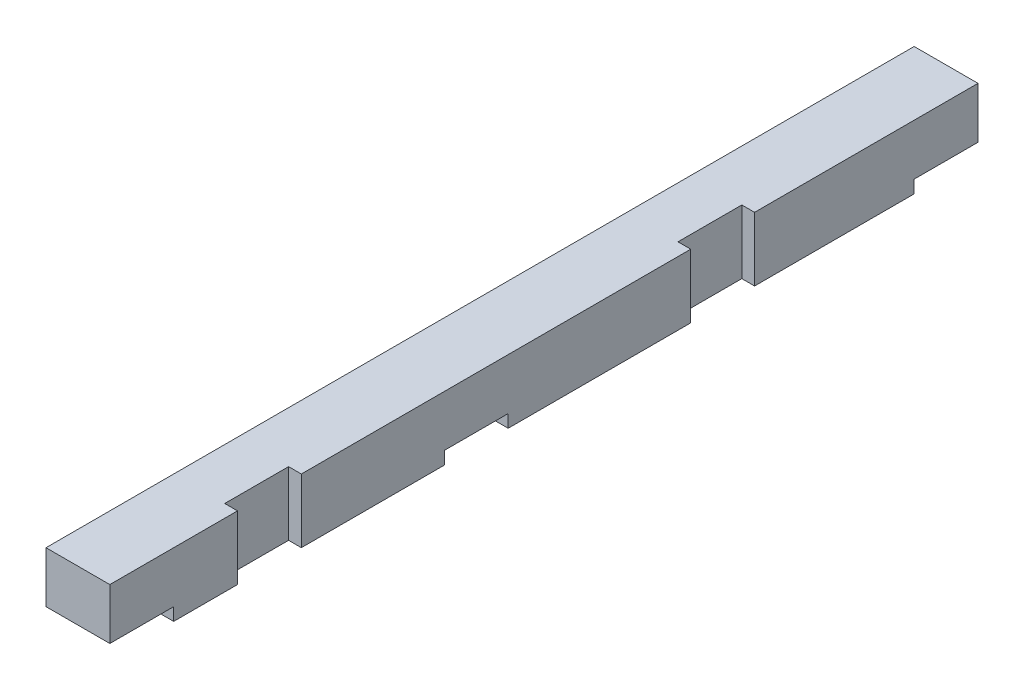
ISO-10303-21;
HEADER;
FILE_DESCRIPTION(('STEP AP214'),'2;1');
FILE_NAME('part.step','',(''),(''),'','','');
FILE_SCHEMA(('AUTOMOTIVE_DESIGN { 1 0 10303 214 1 1 1 1 }'));
ENDSEC;
DATA;
#1=APPLICATION_CONTEXT('core data for automotive mechanical design processes');
#2=APPLICATION_PROTOCOL_DEFINITION('international standard','automotive_design',2000,#1);
#3=PRODUCT_CONTEXT('',#1,'mechanical');
#4=PRODUCT('Part','Part','',(#3));
#5=PRODUCT_RELATED_PRODUCT_CATEGORY('part','',(#4));
#6=PRODUCT_DEFINITION_FORMATION('','',#4);
#7=PRODUCT_DEFINITION_CONTEXT('part definition',#1,'design');
#8=PRODUCT_DEFINITION('design','',#6,#7);
#9=PRODUCT_DEFINITION_SHAPE('','',#8);
#10=(LENGTH_UNIT() NAMED_UNIT(*) SI_UNIT(.MILLI.,.METRE.));
#11=(NAMED_UNIT(*) PLANE_ANGLE_UNIT() SI_UNIT($,.RADIAN.));
#12=(NAMED_UNIT(*) SI_UNIT($,.STERADIAN.) SOLID_ANGLE_UNIT());
#13=UNCERTAINTY_MEASURE_WITH_UNIT(LENGTH_MEASURE(1.E-05),#10,'distance_accuracy_value','');
#14=(GEOMETRIC_REPRESENTATION_CONTEXT(3) GLOBAL_UNCERTAINTY_ASSIGNED_CONTEXT((#13)) GLOBAL_UNIT_ASSIGNED_CONTEXT((#10,
#11,#12)) REPRESENTATION_CONTEXT('',''));
#15=CARTESIAN_POINT('',(0.,0.,0.));
#16=DIRECTION('',(0.,0.,1.));
#17=DIRECTION('',(1.,0.,0.));
#18=AXIS2_PLACEMENT_3D('',#15,#16,#17);
#19=CARTESIAN_POINT('',(10.,0.,136.));
#20=DIRECTION('',(-1.,0.,0.));
#21=DIRECTION('',(0.,0.,1.));
#22=AXIS2_PLACEMENT_3D('',#19,#20,#21);
#23=PLANE('',#22);
#24=DIRECTION('',(0.,0.,-1.));
#25=VECTOR('',#24,1.);
#26=CARTESIAN_POINT('',(10.,0.,136.));
#27=LINE('',#26,#25);
#28=CARTESIAN_POINT('',(10.,0.,126.));
#29=VERTEX_POINT('',#28);
#30=CARTESIAN_POINT('',(10.,0.,116.));
#31=VERTEX_POINT('',#30);
#32=EDGE_CURVE('E315',#29,#31,#27,.T.);
#33=ORIENTED_EDGE('',*,*,#32,.T.);
#34=DIRECTION('',(0.,-1.,0.));
#35=VECTOR('',#34,1.);
#36=CARTESIAN_POINT('',(10.,10.,116.));
#37=LINE('',#36,#35);
#38=CARTESIAN_POINT('',(10.,10.,116.));
#39=VERTEX_POINT('',#38);
#40=EDGE_CURVE('E176',#39,#31,#37,.T.);
#41=ORIENTED_EDGE('',*,*,#40,.F.);
#42=DIRECTION('',(0.,0.,-1.));
#43=VECTOR('',#42,1.);
#44=CARTESIAN_POINT('',(10.,10.,136.));
#45=LINE('',#44,#43);
#46=CARTESIAN_POINT('',(10.,10.,136.));
#47=VERTEX_POINT('',#46);
#48=EDGE_CURVE('E311',#47,#39,#45,.T.);
#49=ORIENTED_EDGE('',*,*,#48,.F.);
#50=DIRECTION('',(0.,1.,0.));
#51=VECTOR('',#50,1.);
#52=CARTESIAN_POINT('',(10.,0.,136.));
#53=LINE('',#52,#51);
#54=CARTESIAN_POINT('',(10.,2.,136.));
#55=VERTEX_POINT('',#54);
#56=EDGE_CURVE('E296',#55,#47,#53,.T.);
#57=ORIENTED_EDGE('',*,*,#56,.F.);
#58=DIRECTION('',(0.,0.,1.));
#59=VECTOR('',#58,1.);
#60=CARTESIAN_POINT('',(10.,2.,136.));
#61=LINE('',#60,#59);
#62=CARTESIAN_POINT('',(10.,2.,126.));
#63=VERTEX_POINT('',#62);
#64=EDGE_CURVE('E279',#63,#55,#61,.T.);
#65=ORIENTED_EDGE('',*,*,#64,.F.);
#66=DIRECTION('',(0.,1.,0.));
#67=VECTOR('',#66,1.);
#68=CARTESIAN_POINT('',(10.,2.,126.));
#69=LINE('',#68,#67);
#70=EDGE_CURVE('E251',#29,#63,#69,.T.);
#71=ORIENTED_EDGE('',*,*,#70,.F.);
#72=EDGE_LOOP('',(#33,#41,#49,#57,#65,#71));
#73=FACE_BOUND('',#72,.T.);
#74=ADVANCED_FACE('F33',(#73),#23,.F.);
#75=CARTESIAN_POINT('',(10.,10.,106.));
#76=VERTEX_POINT('',#75);
#77=CARTESIAN_POINT('',(10.,10.,45.));
#78=VERTEX_POINT('',#77);
#79=EDGE_CURVE('E314',#76,#78,#45,.T.);
#80=ORIENTED_EDGE('',*,*,#79,.F.);
#81=DIRECTION('',(0.,1.,0.));
#82=VECTOR('',#81,1.);
#83=CARTESIAN_POINT('',(10.,10.,106.));
#84=LINE('',#83,#82);
#85=CARTESIAN_POINT('',(10.,0.,106.));
#86=VERTEX_POINT('',#85);
#87=EDGE_CURVE('E189',#86,#76,#84,.T.);
#88=ORIENTED_EDGE('',*,*,#87,.F.);
#89=CARTESIAN_POINT('',(10.,0.,83.6));
#90=VERTEX_POINT('',#89);
#91=EDGE_CURVE('E316',#86,#90,#27,.T.);
#92=ORIENTED_EDGE('',*,*,#91,.T.);
#93=DIRECTION('',(0.,-1.,0.));
#94=VECTOR('',#93,1.);
#95=CARTESIAN_POINT('',(10.,2.,83.6));
#96=LINE('',#95,#94);
#97=CARTESIAN_POINT('',(10.,2.,83.6));
#98=VERTEX_POINT('',#97);
#99=EDGE_CURVE('E240',#98,#90,#96,.T.);
#100=ORIENTED_EDGE('',*,*,#99,.F.);
#101=DIRECTION('',(0.,0.,1.));
#102=VECTOR('',#101,1.);
#103=CARTESIAN_POINT('',(10.,2.,83.6));
#104=LINE('',#103,#102);
#105=CARTESIAN_POINT('',(10.,2.,73.6));
#106=VERTEX_POINT('',#105);
#107=EDGE_CURVE('E233',#106,#98,#104,.T.);
#108=ORIENTED_EDGE('',*,*,#107,.F.);
#109=DIRECTION('',(0.,1.,0.));
#110=VECTOR('',#109,1.);
#111=CARTESIAN_POINT('',(10.,2.,73.6));
#112=LINE('',#111,#110);
#113=CARTESIAN_POINT('',(10.,0.,73.6));
#114=VERTEX_POINT('',#113);
#115=EDGE_CURVE('E243',#114,#106,#112,.T.);
#116=ORIENTED_EDGE('',*,*,#115,.F.);
#117=CARTESIAN_POINT('',(10.,0.,45.));
#118=VERTEX_POINT('',#117);
#119=EDGE_CURVE('E317',#114,#118,#27,.T.);
#120=ORIENTED_EDGE('',*,*,#119,.T.);
#121=DIRECTION('',(0.,-1.,0.));
#122=VECTOR('',#121,1.);
#123=CARTESIAN_POINT('',(10.,0.,45.));
#124=LINE('',#123,#122);
#125=EDGE_CURVE('E201',#78,#118,#124,.T.);
#126=ORIENTED_EDGE('',*,*,#125,.F.);
#127=EDGE_LOOP('',(#80,#88,#92,#100,#108,#116,#120,#126));
#128=FACE_BOUND('',#127,.T.);
#129=ADVANCED_FACE('F359',(#128),#23,.F.);
#130=CARTESIAN_POINT('',(0.,0.,136.));
#131=DIRECTION('',(0.,1.,0.));
#132=DIRECTION('',(0.,0.,1.));
#133=AXIS2_PLACEMENT_3D('',#130,#131,#132);
#134=PLANE('',#133);
#135=DIRECTION('',(0.,0.,-1.));
#136=VECTOR('',#135,1.);
#137=CARTESIAN_POINT('',(8.,0.,116.));
#138=LINE('',#137,#136);
#139=CARTESIAN_POINT('',(8.,0.,116.));
#140=VERTEX_POINT('',#139);
#141=CARTESIAN_POINT('',(8.,0.,106.));
#142=VERTEX_POINT('',#141);
#143=EDGE_CURVE('E185',#140,#142,#138,.T.);
#144=ORIENTED_EDGE('',*,*,#143,.F.);
#145=DIRECTION('',(1.,0.,0.));
#146=VECTOR('',#145,1.);
#147=CARTESIAN_POINT('',(8.,0.,116.));
#148=LINE('',#147,#146);
#149=EDGE_CURVE('E171',#140,#31,#148,.T.);
#150=ORIENTED_EDGE('',*,*,#149,.T.);
#151=ORIENTED_EDGE('',*,*,#32,.F.);
#152=DIRECTION('',(1.,0.,0.));
#153=VECTOR('',#152,1.);
#154=CARTESIAN_POINT('',(0.,0.,126.));
#155=LINE('',#154,#153);
#156=CARTESIAN_POINT('',(0.,0.,126.));
#157=VERTEX_POINT('',#156);
#158=EDGE_CURVE('E282',#157,#29,#155,.T.);
#159=ORIENTED_EDGE('',*,*,#158,.F.);
#160=DIRECTION('',(0.,0.,-1.));
#161=VECTOR('',#160,1.);
#162=CARTESIAN_POINT('',(0.,0.,136.));
#163=LINE('',#162,#161);
#164=CARTESIAN_POINT('',(0.,0.,83.6));
#165=VERTEX_POINT('',#164);
#166=EDGE_CURVE('E11',#157,#165,#163,.T.);
#167=ORIENTED_EDGE('',*,*,#166,.T.);
#168=DIRECTION('',(1.,0.,0.));
#169=VECTOR('',#168,1.);
#170=CARTESIAN_POINT('',(0.,0.,83.6));
#171=LINE('',#170,#169);
#172=EDGE_CURVE('E239',#165,#90,#171,.T.);
#173=ORIENTED_EDGE('',*,*,#172,.T.);
#174=ORIENTED_EDGE('',*,*,#91,.F.);
#175=DIRECTION('',(1.,0.,0.));
#176=VECTOR('',#175,1.);
#177=CARTESIAN_POINT('',(8.,0.,106.));
#178=LINE('',#177,#176);
#179=EDGE_CURVE('E181',#142,#86,#178,.T.);
#180=ORIENTED_EDGE('',*,*,#179,.F.);
#181=EDGE_LOOP('',(#144,#150,#151,#159,#167,#173,#174,#180));
#182=FACE_BOUND('',#181,.T.);
#183=ADVANCED_FACE('F191',(#182),#134,.F.);
#184=CARTESIAN_POINT('',(0.,0.,136.));
#185=DIRECTION('',(1.,0.,0.));
#186=DIRECTION('',(0.,0.,-1.));
#187=AXIS2_PLACEMENT_3D('',#184,#185,#186);
#188=PLANE('',#187);
#189=DIRECTION('',(0.,0.,1.));
#190=VECTOR('',#189,1.);
#191=CARTESIAN_POINT('',(0.,2.,83.6));
#192=LINE('',#191,#190);
#193=CARTESIAN_POINT('',(0.,2.,73.6));
#194=VERTEX_POINT('',#193);
#195=CARTESIAN_POINT('',(0.,2.,83.6));
#196=VERTEX_POINT('',#195);
#197=EDGE_CURVE('E236',#194,#196,#192,.T.);
#198=ORIENTED_EDGE('',*,*,#197,.T.);
#199=DIRECTION('',(0.,-1.,0.));
#200=VECTOR('',#199,1.);
#201=CARTESIAN_POINT('',(0.,2.,83.6));
#202=LINE('',#201,#200);
#203=EDGE_CURVE('E229',#196,#165,#202,.T.);
#204=ORIENTED_EDGE('',*,*,#203,.T.);
#205=ORIENTED_EDGE('',*,*,#166,.F.);
#206=DIRECTION('',(0.,1.,0.));
#207=VECTOR('',#206,1.);
#208=CARTESIAN_POINT('',(0.,2.,126.));
#209=LINE('',#208,#207);
#210=CARTESIAN_POINT('',(0.,2.,126.));
#211=VERTEX_POINT('',#210);
#212=EDGE_CURVE('E275',#157,#211,#209,.T.);
#213=ORIENTED_EDGE('',*,*,#212,.T.);
#214=DIRECTION('',(0.,0.,1.));
#215=VECTOR('',#214,1.);
#216=CARTESIAN_POINT('',(0.,2.,136.));
#217=LINE('',#216,#215);
#218=CARTESIAN_POINT('',(0.,2.,136.));
#219=VERTEX_POINT('',#218);
#220=EDGE_CURVE('E278',#211,#219,#217,.T.);
#221=ORIENTED_EDGE('',*,*,#220,.T.);
#222=DIRECTION('',(0.,-1.,0.));
#223=VECTOR('',#222,1.);
#224=CARTESIAN_POINT('',(0.,0.,136.));
#225=LINE('',#224,#223);
#226=CARTESIAN_POINT('',(0.,10.,136.));
#227=VERTEX_POINT('',#226);
#228=EDGE_CURVE('E293',#227,#219,#225,.T.);
#229=ORIENTED_EDGE('',*,*,#228,.F.);
#230=DIRECTION('',(0.,0.,-1.));
#231=VECTOR('',#230,1.);
#232=CARTESIAN_POINT('',(0.,10.,136.));
#233=LINE('',#232,#231);
#234=CARTESIAN_POINT('',(0.,10.,0.));
#235=VERTEX_POINT('',#234);
#236=EDGE_CURVE('E301',#227,#235,#233,.T.);
#237=ORIENTED_EDGE('',*,*,#236,.T.);
#238=DIRECTION('',(0.,-1.,0.));
#239=VECTOR('',#238,1.);
#240=CARTESIAN_POINT('',(0.,0.,0.));
#241=LINE('',#240,#239);
#242=CARTESIAN_POINT('',(0.,2.,0.));
#243=VERTEX_POINT('',#242);
#244=EDGE_CURVE('E289',#235,#243,#241,.T.);
#245=ORIENTED_EDGE('',*,*,#244,.T.);
#246=DIRECTION('',(0.,0.,1.));
#247=VECTOR('',#246,1.);
#248=CARTESIAN_POINT('',(0.,2.,10.));
#249=LINE('',#248,#247);
#250=CARTESIAN_POINT('',(0.,2.,10.));
#251=VERTEX_POINT('',#250);
#252=EDGE_CURVE('E261',#243,#251,#249,.T.);
#253=ORIENTED_EDGE('',*,*,#252,.T.);
#254=DIRECTION('',(0.,-1.,0.));
#255=VECTOR('',#254,1.);
#256=CARTESIAN_POINT('',(0.,2.,10.));
#257=LINE('',#256,#255);
#258=CARTESIAN_POINT('',(0.,0.,10.));
#259=VERTEX_POINT('',#258);
#260=EDGE_CURVE('E258',#251,#259,#257,.T.);
#261=ORIENTED_EDGE('',*,*,#260,.T.);
#262=CARTESIAN_POINT('',(0.,0.,73.6));
#263=VERTEX_POINT('',#262);
#264=EDGE_CURVE('E41',#263,#259,#163,.T.);
#265=ORIENTED_EDGE('',*,*,#264,.F.);
#266=DIRECTION('',(0.,1.,0.));
#267=VECTOR('',#266,1.);
#268=CARTESIAN_POINT('',(0.,2.,73.6));
#269=LINE('',#268,#267);
#270=EDGE_CURVE('E232',#263,#194,#269,.T.);
#271=ORIENTED_EDGE('',*,*,#270,.T.);
#272=EDGE_LOOP('',(#198,#204,#205,#213,#221,#229,#237,#245,#253,#261,#265,#271));
#273=FACE_BOUND('',#272,.T.);
#274=ADVANCED_FACE('F35',(#273),#188,.F.);
#275=DIRECTION('',(0.,0.,-1.));
#276=VECTOR('',#275,1.);
#277=CARTESIAN_POINT('',(8.,0.,45.));
#278=LINE('',#277,#276);
#279=CARTESIAN_POINT('',(8.,0.,45.));
#280=VERTEX_POINT('',#279);
#281=CARTESIAN_POINT('',(8.,0.,35.));
#282=VERTEX_POINT('',#281);
#283=EDGE_CURVE('E209',#280,#282,#278,.T.);
#284=ORIENTED_EDGE('',*,*,#283,.F.);
#285=DIRECTION('',(1.,0.,0.));
#286=VECTOR('',#285,1.);
#287=CARTESIAN_POINT('',(8.,0.,45.));
#288=LINE('',#287,#286);
#289=EDGE_CURVE('E215',#280,#118,#288,.T.);
#290=ORIENTED_EDGE('',*,*,#289,.T.);
#291=ORIENTED_EDGE('',*,*,#119,.F.);
#292=DIRECTION('',(1.,0.,0.));
#293=VECTOR('',#292,1.);
#294=CARTESIAN_POINT('',(0.,0.,73.6));
#295=LINE('',#294,#293);
#296=EDGE_CURVE('E254',#263,#114,#295,.T.);
#297=ORIENTED_EDGE('',*,*,#296,.F.);
#298=ORIENTED_EDGE('',*,*,#264,.T.);
#299=DIRECTION('',(1.,0.,0.));
#300=VECTOR('',#299,1.);
#301=CARTESIAN_POINT('',(0.,0.,10.));
#302=LINE('',#301,#300);
#303=CARTESIAN_POINT('',(10.,0.,10.));
#304=VERTEX_POINT('',#303);
#305=EDGE_CURVE('E265',#259,#304,#302,.T.);
#306=ORIENTED_EDGE('',*,*,#305,.T.);
#307=CARTESIAN_POINT('',(10.,0.,35.));
#308=VERTEX_POINT('',#307);
#309=EDGE_CURVE('E313',#308,#304,#27,.T.);
#310=ORIENTED_EDGE('',*,*,#309,.F.);
#311=DIRECTION('',(1.,0.,0.));
#312=VECTOR('',#311,1.);
#313=CARTESIAN_POINT('',(8.,0.,35.));
#314=LINE('',#313,#312);
#315=EDGE_CURVE('E225',#282,#308,#314,.T.);
#316=ORIENTED_EDGE('',*,*,#315,.F.);
#317=EDGE_LOOP('',(#284,#290,#291,#297,#298,#306,#310,#316));
#318=FACE_BOUND('',#317,.T.);
#319=ADVANCED_FACE('F339',(#318),#134,.F.);
#320=CARTESIAN_POINT('',(10.,10.,35.));
#321=VERTEX_POINT('',#320);
#322=CARTESIAN_POINT('',(10.,10.,0.));
#323=VERTEX_POINT('',#322);
#324=EDGE_CURVE('E310',#321,#323,#45,.T.);
#325=ORIENTED_EDGE('',*,*,#324,.F.);
#326=DIRECTION('',(0.,1.,0.));
#327=VECTOR('',#326,1.);
#328=CARTESIAN_POINT('',(10.,0.,35.));
#329=LINE('',#328,#327);
#330=EDGE_CURVE('E210',#308,#321,#329,.T.);
#331=ORIENTED_EDGE('',*,*,#330,.F.);
#332=ORIENTED_EDGE('',*,*,#309,.T.);
#333=DIRECTION('',(0.,-1.,0.));
#334=VECTOR('',#333,1.);
#335=CARTESIAN_POINT('',(10.,2.,10.));
#336=LINE('',#335,#334);
#337=CARTESIAN_POINT('',(10.,2.,10.));
#338=VERTEX_POINT('',#337);
#339=EDGE_CURVE('E221',#338,#304,#336,.T.);
#340=ORIENTED_EDGE('',*,*,#339,.F.);
#341=DIRECTION('',(0.,0.,1.));
#342=VECTOR('',#341,1.);
#343=CARTESIAN_POINT('',(10.,2.,10.));
#344=LINE('',#343,#342);
#345=CARTESIAN_POINT('',(10.,2.,0.));
#346=VERTEX_POINT('',#345);
#347=EDGE_CURVE('E262',#346,#338,#344,.T.);
#348=ORIENTED_EDGE('',*,*,#347,.F.);
#349=DIRECTION('',(0.,1.,0.));
#350=VECTOR('',#349,1.);
#351=CARTESIAN_POINT('',(10.,0.,0.));
#352=LINE('',#351,#350);
#353=EDGE_CURVE('E304',#346,#323,#352,.T.);
#354=ORIENTED_EDGE('',*,*,#353,.T.);
#355=EDGE_LOOP('',(#325,#331,#332,#340,#348,#354));
#356=FACE_BOUND('',#355,.T.);
#357=ADVANCED_FACE('F331',(#356),#23,.F.);
#358=CARTESIAN_POINT('',(0.,10.,136.));
#359=DIRECTION('',(0.,-1.,0.));
#360=DIRECTION('',(0.,0.,-1.));
#361=AXIS2_PLACEMENT_3D('',#358,#359,#360);
#362=PLANE('',#361);
#363=ORIENTED_EDGE('',*,*,#48,.T.);
#364=DIRECTION('',(1.,0.,0.));
#365=VECTOR('',#364,1.);
#366=CARTESIAN_POINT('',(8.,10.,116.));
#367=LINE('',#366,#365);
#368=CARTESIAN_POINT('',(8.,10.,116.));
#369=VERTEX_POINT('',#368);
#370=EDGE_CURVE('E199',#369,#39,#367,.T.);
#371=ORIENTED_EDGE('',*,*,#370,.F.);
#372=DIRECTION('',(0.,0.,1.));
#373=VECTOR('',#372,1.);
#374=CARTESIAN_POINT('',(8.,10.,116.));
#375=LINE('',#374,#373);
#376=CARTESIAN_POINT('',(8.,10.,106.));
#377=VERTEX_POINT('',#376);
#378=EDGE_CURVE('E182',#377,#369,#375,.T.);
#379=ORIENTED_EDGE('',*,*,#378,.F.);
#380=DIRECTION('',(1.,0.,0.));
#381=VECTOR('',#380,1.);
#382=CARTESIAN_POINT('',(8.,10.,106.));
#383=LINE('',#382,#381);
#384=EDGE_CURVE('E202',#377,#76,#383,.T.);
#385=ORIENTED_EDGE('',*,*,#384,.T.);
#386=ORIENTED_EDGE('',*,*,#79,.T.);
#387=DIRECTION('',(1.,0.,0.));
#388=VECTOR('',#387,1.);
#389=CARTESIAN_POINT('',(8.,10.,45.));
#390=LINE('',#389,#388);
#391=CARTESIAN_POINT('',(8.,10.,45.));
#392=VERTEX_POINT('',#391);
#393=EDGE_CURVE('E218',#392,#78,#390,.T.);
#394=ORIENTED_EDGE('',*,*,#393,.F.);
#395=DIRECTION('',(0.,0.,1.));
#396=VECTOR('',#395,1.);
#397=CARTESIAN_POINT('',(8.,10.,45.));
#398=LINE('',#397,#396);
#399=CARTESIAN_POINT('',(8.,10.,35.));
#400=VERTEX_POINT('',#399);
#401=EDGE_CURVE('E213',#400,#392,#398,.T.);
#402=ORIENTED_EDGE('',*,*,#401,.F.);
#403=DIRECTION('',(1.,0.,0.));
#404=VECTOR('',#403,1.);
#405=CARTESIAN_POINT('',(8.,10.,35.));
#406=LINE('',#405,#404);
#407=EDGE_CURVE('E222',#400,#321,#406,.T.);
#408=ORIENTED_EDGE('',*,*,#407,.T.);
#409=ORIENTED_EDGE('',*,*,#324,.T.);
#410=DIRECTION('',(-1.,0.,0.));
#411=VECTOR('',#410,1.);
#412=CARTESIAN_POINT('',(0.,10.,0.));
#413=LINE('',#412,#411);
#414=EDGE_CURVE('E297',#323,#235,#413,.T.);
#415=ORIENTED_EDGE('',*,*,#414,.T.);
#416=ORIENTED_EDGE('',*,*,#236,.F.);
#417=DIRECTION('',(-1.,0.,0.));
#418=VECTOR('',#417,1.);
#419=CARTESIAN_POINT('',(0.,10.,136.));
#420=LINE('',#419,#418);
#421=EDGE_CURVE('E299',#47,#227,#420,.T.);
#422=ORIENTED_EDGE('',*,*,#421,.F.);
#423=EDGE_LOOP('',(#363,#371,#379,#385,#386,#394,#402,#408,#409,#415,#416,#422));
#424=FACE_BOUND('',#423,.T.);
#425=ADVANCED_FACE('F354',(#424),#362,.F.);
#426=CARTESIAN_POINT('',(0.,0.,136.));
#427=DIRECTION('',(0.,0.,-1.));
#428=DIRECTION('',(-1.,0.,0.));
#429=AXIS2_PLACEMENT_3D('',#426,#427,#428);
#430=PLANE('',#429);
#431=ORIENTED_EDGE('',*,*,#228,.T.);
#432=DIRECTION('',(1.,0.,0.));
#433=VECTOR('',#432,1.);
#434=CARTESIAN_POINT('',(0.,2.,136.));
#435=LINE('',#434,#433);
#436=EDGE_CURVE('E286',#219,#55,#435,.T.);
#437=ORIENTED_EDGE('',*,*,#436,.T.);
#438=ORIENTED_EDGE('',*,*,#56,.T.);
#439=ORIENTED_EDGE('',*,*,#421,.T.);
#440=EDGE_LOOP('',(#431,#437,#438,#439));
#441=FACE_BOUND('',#440,.T.);
#442=ADVANCED_FACE('F373',(#441),#430,.F.);
#443=CARTESIAN_POINT('',(0.,0.,0.));
#444=DIRECTION('',(0.,0.,-1.));
#445=DIRECTION('',(-1.,0.,0.));
#446=AXIS2_PLACEMENT_3D('',#443,#444,#445);
#447=PLANE('',#446);
#448=DIRECTION('',(1.,0.,0.));
#449=VECTOR('',#448,1.);
#450=CARTESIAN_POINT('',(0.,2.,0.));
#451=LINE('',#450,#449);
#452=EDGE_CURVE('E271',#243,#346,#451,.T.);
#453=ORIENTED_EDGE('',*,*,#452,.F.);
#454=ORIENTED_EDGE('',*,*,#244,.F.);
#455=ORIENTED_EDGE('',*,*,#414,.F.);
#456=ORIENTED_EDGE('',*,*,#353,.F.);
#457=EDGE_LOOP('',(#453,#454,#455,#456));
#458=FACE_BOUND('',#457,.T.);
#459=ADVANCED_FACE('F349',(#458),#447,.T.);
#460=CARTESIAN_POINT('',(0.,2.,136.));
#461=DIRECTION('',(0.,1.,0.));
#462=DIRECTION('',(0.,0.,1.));
#463=AXIS2_PLACEMENT_3D('',#460,#461,#462);
#464=PLANE('',#463);
#465=ORIENTED_EDGE('',*,*,#64,.T.);
#466=ORIENTED_EDGE('',*,*,#436,.F.);
#467=ORIENTED_EDGE('',*,*,#220,.F.);
#468=DIRECTION('',(1.,0.,0.));
#469=VECTOR('',#468,1.);
#470=CARTESIAN_POINT('',(0.,2.,126.));
#471=LINE('',#470,#469);
#472=EDGE_CURVE('E290',#211,#63,#471,.T.);
#473=ORIENTED_EDGE('',*,*,#472,.T.);
#474=EDGE_LOOP('',(#465,#466,#467,#473));
#475=FACE_BOUND('',#474,.T.);
#476=ADVANCED_FACE('F394',(#475),#464,.F.);
#477=CARTESIAN_POINT('',(0.,2.,126.));
#478=DIRECTION('',(0.,0.,-1.));
#479=DIRECTION('',(-1.,0.,0.));
#480=AXIS2_PLACEMENT_3D('',#477,#478,#479);
#481=PLANE('',#480);
#482=ORIENTED_EDGE('',*,*,#70,.T.);
#483=ORIENTED_EDGE('',*,*,#472,.F.);
#484=ORIENTED_EDGE('',*,*,#212,.F.);
#485=ORIENTED_EDGE('',*,*,#158,.T.);
#486=EDGE_LOOP('',(#482,#483,#484,#485));
#487=FACE_BOUND('',#486,.T.);
#488=ADVANCED_FACE('F403',(#487),#481,.F.);
#489=CARTESIAN_POINT('',(0.,2.,10.));
#490=DIRECTION('',(0.,0.,1.));
#491=DIRECTION('',(0.,-1.,0.));
#492=AXIS2_PLACEMENT_3D('',#489,#490,#491);
#493=PLANE('',#492);
#494=ORIENTED_EDGE('',*,*,#339,.T.);
#495=ORIENTED_EDGE('',*,*,#305,.F.);
#496=ORIENTED_EDGE('',*,*,#260,.F.);
#497=DIRECTION('',(1.,0.,0.));
#498=VECTOR('',#497,1.);
#499=CARTESIAN_POINT('',(0.,2.,10.));
#500=LINE('',#499,#498);
#501=EDGE_CURVE('E244',#251,#338,#500,.T.);
#502=ORIENTED_EDGE('',*,*,#501,.T.);
#503=EDGE_LOOP('',(#494,#495,#496,#502));
#504=FACE_BOUND('',#503,.T.);
#505=ADVANCED_FACE('F336',(#504),#493,.F.);
#506=CARTESIAN_POINT('',(0.,2.,10.));
#507=DIRECTION('',(0.,1.,0.));
#508=DIRECTION('',(0.,0.,1.));
#509=AXIS2_PLACEMENT_3D('',#506,#507,#508);
#510=PLANE('',#509);
#511=ORIENTED_EDGE('',*,*,#347,.T.);
#512=ORIENTED_EDGE('',*,*,#501,.F.);
#513=ORIENTED_EDGE('',*,*,#252,.F.);
#514=ORIENTED_EDGE('',*,*,#452,.T.);
#515=EDGE_LOOP('',(#511,#512,#513,#514));
#516=FACE_BOUND('',#515,.T.);
#517=ADVANCED_FACE('F346',(#516),#510,.F.);
#518=CARTESIAN_POINT('',(0.,2.,83.6));
#519=DIRECTION('',(0.,0.,1.));
#520=DIRECTION('',(1.,0.,0.));
#521=AXIS2_PLACEMENT_3D('',#518,#519,#520);
#522=PLANE('',#521);
#523=ORIENTED_EDGE('',*,*,#99,.T.);
#524=ORIENTED_EDGE('',*,*,#172,.F.);
#525=ORIENTED_EDGE('',*,*,#203,.F.);
#526=DIRECTION('',(1.,0.,0.));
#527=VECTOR('',#526,1.);
#528=CARTESIAN_POINT('',(0.,2.,83.6));
#529=LINE('',#528,#527);
#530=EDGE_CURVE('E249',#196,#98,#529,.T.);
#531=ORIENTED_EDGE('',*,*,#530,.T.);
#532=EDGE_LOOP('',(#523,#524,#525,#531));
#533=FACE_BOUND('',#532,.T.);
#534=ADVANCED_FACE('F432',(#533),#522,.F.);
#535=CARTESIAN_POINT('',(0.,2.,83.6));
#536=DIRECTION('',(0.,1.,0.));
#537=DIRECTION('',(0.,0.,1.));
#538=AXIS2_PLACEMENT_3D('',#535,#536,#537);
#539=PLANE('',#538);
#540=ORIENTED_EDGE('',*,*,#107,.T.);
#541=ORIENTED_EDGE('',*,*,#530,.F.);
#542=ORIENTED_EDGE('',*,*,#197,.F.);
#543=DIRECTION('',(1.,0.,0.));
#544=VECTOR('',#543,1.);
#545=CARTESIAN_POINT('',(0.,2.,73.6));
#546=LINE('',#545,#544);
#547=EDGE_CURVE('E252',#194,#106,#546,.T.);
#548=ORIENTED_EDGE('',*,*,#547,.T.);
#549=EDGE_LOOP('',(#540,#541,#542,#548));
#550=FACE_BOUND('',#549,.T.);
#551=ADVANCED_FACE('F441',(#550),#539,.F.);
#552=CARTESIAN_POINT('',(0.,2.,73.6));
#553=DIRECTION('',(0.,0.,-1.));
#554=DIRECTION('',(-1.,0.,0.));
#555=AXIS2_PLACEMENT_3D('',#552,#553,#554);
#556=PLANE('',#555);
#557=ORIENTED_EDGE('',*,*,#115,.T.);
#558=ORIENTED_EDGE('',*,*,#547,.F.);
#559=ORIENTED_EDGE('',*,*,#270,.F.);
#560=ORIENTED_EDGE('',*,*,#296,.T.);
#561=EDGE_LOOP('',(#557,#558,#559,#560));
#562=FACE_BOUND('',#561,.T.);
#563=ADVANCED_FACE('F450',(#562),#556,.F.);
#564=CARTESIAN_POINT('',(8.,0.,45.));
#565=DIRECTION('',(0.,0.,1.));
#566=DIRECTION('',(1.,0.,0.));
#567=AXIS2_PLACEMENT_3D('',#564,#565,#566);
#568=PLANE('',#567);
#569=ORIENTED_EDGE('',*,*,#125,.T.);
#570=ORIENTED_EDGE('',*,*,#289,.F.);
#571=DIRECTION('',(0.,-1.,0.));
#572=VECTOR('',#571,1.);
#573=CARTESIAN_POINT('',(8.,0.,45.));
#574=LINE('',#573,#572);
#575=EDGE_CURVE('E206',#392,#280,#574,.T.);
#576=ORIENTED_EDGE('',*,*,#575,.F.);
#577=ORIENTED_EDGE('',*,*,#393,.T.);
#578=EDGE_LOOP('',(#569,#570,#576,#577));
#579=FACE_BOUND('',#578,.T.);
#580=ADVANCED_FACE('F358',(#579),#568,.F.);
#581=CARTESIAN_POINT('',(8.,0.,35.));
#582=DIRECTION('',(0.,0.,-1.));
#583=DIRECTION('',(-1.,0.,0.));
#584=AXIS2_PLACEMENT_3D('',#581,#582,#583);
#585=PLANE('',#584);
#586=ORIENTED_EDGE('',*,*,#330,.T.);
#587=ORIENTED_EDGE('',*,*,#407,.F.);
#588=DIRECTION('',(0.,1.,0.));
#589=VECTOR('',#588,1.);
#590=CARTESIAN_POINT('',(8.,0.,35.));
#591=LINE('',#590,#589);
#592=EDGE_CURVE('E56',#282,#400,#591,.T.);
#593=ORIENTED_EDGE('',*,*,#592,.F.);
#594=ORIENTED_EDGE('',*,*,#315,.T.);
#595=EDGE_LOOP('',(#586,#587,#593,#594));
#596=FACE_BOUND('',#595,.T.);
#597=ADVANCED_FACE('F467',(#596),#585,.F.);
#598=CARTESIAN_POINT('',(8.,0.,0.));
#599=DIRECTION('',(-1.,0.,0.));
#600=DIRECTION('',(0.,0.,1.));
#601=AXIS2_PLACEMENT_3D('',#598,#599,#600);
#602=PLANE('',#601);
#603=ORIENTED_EDGE('',*,*,#575,.T.);
#604=ORIENTED_EDGE('',*,*,#283,.T.);
#605=ORIENTED_EDGE('',*,*,#592,.T.);
#606=ORIENTED_EDGE('',*,*,#401,.T.);
#607=EDGE_LOOP('',(#603,#604,#605,#606));
#608=FACE_BOUND('',#607,.T.);
#609=ADVANCED_FACE('F474',(#608),#602,.F.);
#610=CARTESIAN_POINT('',(8.,10.,116.));
#611=DIRECTION('',(0.,0.,1.));
#612=DIRECTION('',(1.,0.,0.));
#613=AXIS2_PLACEMENT_3D('',#610,#611,#612);
#614=PLANE('',#613);
#615=ORIENTED_EDGE('',*,*,#40,.T.);
#616=ORIENTED_EDGE('',*,*,#149,.F.);
#617=DIRECTION('',(0.,-1.,0.));
#618=VECTOR('',#617,1.);
#619=CARTESIAN_POINT('',(8.,10.,116.));
#620=LINE('',#619,#618);
#621=EDGE_CURVE('E174',#369,#140,#620,.T.);
#622=ORIENTED_EDGE('',*,*,#621,.F.);
#623=ORIENTED_EDGE('',*,*,#370,.T.);
#624=EDGE_LOOP('',(#615,#616,#622,#623));
#625=FACE_BOUND('',#624,.T.);
#626=ADVANCED_FACE('F173',(#625),#614,.F.);
#627=CARTESIAN_POINT('',(8.,10.,106.));
#628=DIRECTION('',(0.,0.,-1.));
#629=DIRECTION('',(-1.,0.,0.));
#630=AXIS2_PLACEMENT_3D('',#627,#628,#629);
#631=PLANE('',#630);
#632=ORIENTED_EDGE('',*,*,#87,.T.);
#633=ORIENTED_EDGE('',*,*,#384,.F.);
#634=DIRECTION('',(0.,1.,0.));
#635=VECTOR('',#634,1.);
#636=CARTESIAN_POINT('',(8.,10.,106.));
#637=LINE('',#636,#635);
#638=EDGE_CURVE('E48',#142,#377,#637,.T.);
#639=ORIENTED_EDGE('',*,*,#638,.F.);
#640=ORIENTED_EDGE('',*,*,#179,.T.);
#641=EDGE_LOOP('',(#632,#633,#639,#640));
#642=FACE_BOUND('',#641,.T.);
#643=ADVANCED_FACE('F495',(#642),#631,.F.);
#644=CARTESIAN_POINT('',(8.,0.,0.));
#645=DIRECTION('',(1.,0.,0.));
#646=DIRECTION('',(0.,0.,-1.));
#647=AXIS2_PLACEMENT_3D('',#644,#645,#646);
#648=PLANE('',#647);
#649=ORIENTED_EDGE('',*,*,#621,.T.);
#650=ORIENTED_EDGE('',*,*,#143,.T.);
#651=ORIENTED_EDGE('',*,*,#638,.T.);
#652=ORIENTED_EDGE('',*,*,#378,.T.);
#653=EDGE_LOOP('',(#649,#650,#651,#652));
#654=FACE_BOUND('',#653,.T.);
#655=ADVANCED_FACE('F184',(#654),#648,.T.);
#656=CLOSED_SHELL('',(#74,#129,#183,#274,#319,#357,#425,#442,#459,#476,#488,#505,#517,#534,#551,
#563,#580,#597,#609,#626,#643,#655));
#657=MANIFOLD_SOLID_BREP('B2',#656);
#658=ADVANCED_BREP_SHAPE_REPRESENTATION('',(#18,#657),#14);
#659=SHAPE_DEFINITION_REPRESENTATION(#9,#658);
ENDSEC;
END-ISO-10303-21;
